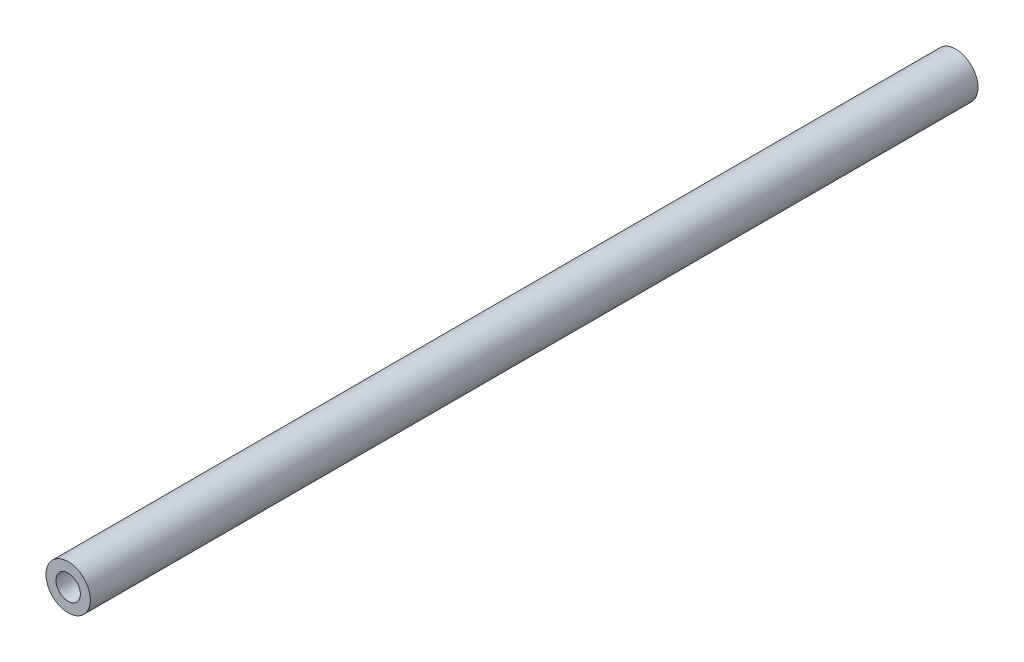
ISO-10303-21;
HEADER;
FILE_DESCRIPTION(('STEP AP214'),'2;1');
FILE_NAME('part.step','',(''),(''),'','','');
FILE_SCHEMA(('AUTOMOTIVE_DESIGN { 1 0 10303 214 1 1 1 1 }'));
ENDSEC;
DATA;
#1=APPLICATION_CONTEXT('core data for automotive mechanical design processes');
#2=APPLICATION_PROTOCOL_DEFINITION('international standard','automotive_design',2000,#1);
#3=PRODUCT_CONTEXT('',#1,'mechanical');
#4=PRODUCT('Part','Part','',(#3));
#5=PRODUCT_RELATED_PRODUCT_CATEGORY('part','',(#4));
#6=PRODUCT_DEFINITION_FORMATION('','',#4);
#7=PRODUCT_DEFINITION_CONTEXT('part definition',#1,'design');
#8=PRODUCT_DEFINITION('design','',#6,#7);
#9=PRODUCT_DEFINITION_SHAPE('','',#8);
#10=(LENGTH_UNIT() NAMED_UNIT(*) SI_UNIT(.MILLI.,.METRE.));
#11=(NAMED_UNIT(*) PLANE_ANGLE_UNIT() SI_UNIT($,.RADIAN.));
#12=(NAMED_UNIT(*) SI_UNIT($,.STERADIAN.) SOLID_ANGLE_UNIT());
#13=UNCERTAINTY_MEASURE_WITH_UNIT(LENGTH_MEASURE(1.E-05),#10,'distance_accuracy_value','');
#14=(GEOMETRIC_REPRESENTATION_CONTEXT(3) GLOBAL_UNCERTAINTY_ASSIGNED_CONTEXT((#13)) GLOBAL_UNIT_ASSIGNED_CONTEXT((#10,
#11,#12)) REPRESENTATION_CONTEXT('',''));
#15=CARTESIAN_POINT('',(0.,0.,0.));
#16=DIRECTION('',(0.,0.,1.));
#17=DIRECTION('',(1.,0.,0.));
#18=AXIS2_PLACEMENT_3D('',#15,#16,#17);
#19=CARTESIAN_POINT('',(0.,0.,120.));
#20=DIRECTION('',(0.,0.,-1.));
#21=DIRECTION('',(-1.,0.,0.));
#22=AXIS2_PLACEMENT_3D('',#19,#20,#21);
#23=CYLINDRICAL_SURFACE('',#22,3.);
#24=CARTESIAN_POINT('',(0.,0.,120.));
#25=DIRECTION('',(0.,0.,1.));
#26=DIRECTION('',(1.,0.,0.));
#27=AXIS2_PLACEMENT_3D('',#24,#25,#26);
#28=CIRCLE('',#27,3.);
#29=CARTESIAN_POINT('',(3.,0.,120.));
#30=VERTEX_POINT('',#29);
#31=EDGE_CURVE('E11',#30,#30,#28,.T.);
#32=ORIENTED_EDGE('',*,*,#31,.F.);
#33=EDGE_LOOP('',(#32));
#34=FACE_BOUND('',#33,.T.);
#35=CARTESIAN_POINT('',(0.,0.,0.));
#36=DIRECTION('',(0.,0.,1.));
#37=DIRECTION('',(1.,0.,0.));
#38=AXIS2_PLACEMENT_3D('',#35,#36,#37);
#39=CIRCLE('',#38,3.);
#40=CARTESIAN_POINT('',(3.,0.,0.));
#41=VERTEX_POINT('',#40);
#42=EDGE_CURVE('E42',#41,#41,#39,.T.);
#43=ORIENTED_EDGE('',*,*,#42,.T.);
#44=EDGE_LOOP('',(#43));
#45=FACE_BOUND('',#44,.T.);
#46=ADVANCED_FACE('F39',(#34,#45),#23,.T.);
#47=CARTESIAN_POINT('',(0.,0.,120.));
#48=DIRECTION('',(0.,0.,1.));
#49=DIRECTION('',(1.,0.,0.));
#50=AXIS2_PLACEMENT_3D('',#47,#48,#49);
#51=PLANE('',#50);
#52=CARTESIAN_POINT('',(0.,0.,120.));
#53=DIRECTION('',(0.,0.,1.));
#54=DIRECTION('',(1.,0.,0.));
#55=AXIS2_PLACEMENT_3D('',#52,#53,#54);
#56=CIRCLE('',#55,1.64999999999999);
#57=CARTESIAN_POINT('',(1.64999999999999,0.,120.));
#58=VERTEX_POINT('',#57);
#59=EDGE_CURVE('E62',#58,#58,#56,.T.);
#60=ORIENTED_EDGE('',*,*,#59,.F.);
#61=EDGE_LOOP('',(#60));
#62=FACE_BOUND('',#61,.T.);
#63=ORIENTED_EDGE('',*,*,#31,.T.);
#64=EDGE_LOOP('',(#63));
#65=FACE_BOUND('',#64,.T.);
#66=ADVANCED_FACE('F81',(#62,#65),#51,.T.);
#67=CARTESIAN_POINT('',(0.,0.,0.));
#68=DIRECTION('',(0.,0.,1.));
#69=DIRECTION('',(1.,0.,0.));
#70=AXIS2_PLACEMENT_3D('',#67,#68,#69);
#71=PLANE('',#70);
#72=CARTESIAN_POINT('',(0.,0.,0.));
#73=DIRECTION('',(0.,0.,-1.));
#74=DIRECTION('',(-1.,0.,0.));
#75=AXIS2_PLACEMENT_3D('',#72,#73,#74);
#76=CIRCLE('',#75,1.64999999999999);
#77=CARTESIAN_POINT('',(-1.64999999999999,0.,0.));
#78=VERTEX_POINT('',#77);
#79=EDGE_CURVE('E63',#78,#78,#76,.T.);
#80=ORIENTED_EDGE('',*,*,#79,.F.);
#81=EDGE_LOOP('',(#80));
#82=FACE_BOUND('',#81,.T.);
#83=ORIENTED_EDGE('',*,*,#42,.F.);
#84=EDGE_LOOP('',(#83));
#85=FACE_BOUND('',#84,.T.);
#86=ADVANCED_FACE('F78',(#82,#85),#71,.F.);
#87=CARTESIAN_POINT('',(0.,0.,110.));
#88=DIRECTION('',(0.,0.,1.));
#89=DIRECTION('',(1.,0.,0.));
#90=AXIS2_PLACEMENT_3D('',#87,#88,#89);
#91=CONICAL_SURFACE('',#90,1.65,1.02974425867665);
#92=CARTESIAN_POINT('',(0.,0.,109.008579978605));
#93=VERTEX_POINT('',#92);
#94=VERTEX_LOOP('',#93);
#95=FACE_BOUND('',#94,.T.);
#96=CARTESIAN_POINT('',(0.,0.,110.));
#97=DIRECTION('',(0.,0.,1.));
#98=DIRECTION('',(1.,0.,0.));
#99=AXIS2_PLACEMENT_3D('',#96,#97,#98);
#100=CIRCLE('',#99,1.65);
#101=CARTESIAN_POINT('',(1.65,0.,110.));
#102=VERTEX_POINT('',#101);
#103=EDGE_CURVE('E66',#102,#102,#100,.T.);
#104=ORIENTED_EDGE('',*,*,#103,.T.);
#105=EDGE_LOOP('',(#104));
#106=FACE_BOUND('',#105,.T.);
#107=ADVANCED_FACE('F80',(#95,#106),#91,.F.);
#108=CARTESIAN_POINT('',(0.,0.,120.));
#109=DIRECTION('',(0.,0.,1.));
#110=DIRECTION('',(1.,0.,0.));
#111=AXIS2_PLACEMENT_3D('',#108,#109,#110);
#112=CYLINDRICAL_SURFACE('',#111,1.64999999999999);
#113=ORIENTED_EDGE('',*,*,#103,.F.);
#114=EDGE_LOOP('',(#113));
#115=FACE_BOUND('',#114,.T.);
#116=ORIENTED_EDGE('',*,*,#59,.T.);
#117=EDGE_LOOP('',(#116));
#118=FACE_BOUND('',#117,.T.);
#119=ADVANCED_FACE('F56',(#115,#118),#112,.F.);
#120=CARTESIAN_POINT('',(0.,0.,10.));
#121=DIRECTION('',(0.,0.,-1.));
#122=DIRECTION('',(-1.,0.,0.));
#123=AXIS2_PLACEMENT_3D('',#120,#121,#122);
#124=CONICAL_SURFACE('',#123,1.65,1.02974425867665);
#125=CARTESIAN_POINT('',(0.,0.,10.9914200213955));
#126=VERTEX_POINT('',#125);
#127=VERTEX_LOOP('',#126);
#128=FACE_BOUND('',#127,.T.);
#129=CARTESIAN_POINT('',(0.,0.,10.));
#130=DIRECTION('',(0.,0.,-1.));
#131=DIRECTION('',(-1.,0.,0.));
#132=AXIS2_PLACEMENT_3D('',#129,#130,#131);
#133=CIRCLE('',#132,1.65);
#134=CARTESIAN_POINT('',(-1.65,0.,10.));
#135=VERTEX_POINT('',#134);
#136=EDGE_CURVE('E60',#135,#135,#133,.T.);
#137=ORIENTED_EDGE('',*,*,#136,.T.);
#138=EDGE_LOOP('',(#137));
#139=FACE_BOUND('',#138,.T.);
#140=ADVANCED_FACE('F52',(#128,#139),#124,.F.);
#141=CARTESIAN_POINT('',(0.,0.,0.));
#142=DIRECTION('',(0.,0.,-1.));
#143=DIRECTION('',(-1.,0.,0.));
#144=AXIS2_PLACEMENT_3D('',#141,#142,#143);
#145=CYLINDRICAL_SURFACE('',#144,1.64999999999999);
#146=ORIENTED_EDGE('',*,*,#136,.F.);
#147=EDGE_LOOP('',(#146));
#148=FACE_BOUND('',#147,.T.);
#149=ORIENTED_EDGE('',*,*,#79,.T.);
#150=EDGE_LOOP('',(#149));
#151=FACE_BOUND('',#150,.T.);
#152=ADVANCED_FACE('F55',(#148,#151),#145,.F.);
#153=CLOSED_SHELL('',(#46,#66,#86,#107,#119,#140,#152));
#154=MANIFOLD_SOLID_BREP('B2',#153);
#155=ADVANCED_BREP_SHAPE_REPRESENTATION('',(#18,#154),#14);
#156=SHAPE_DEFINITION_REPRESENTATION(#9,#155);
ENDSEC;
END-ISO-10303-21;
